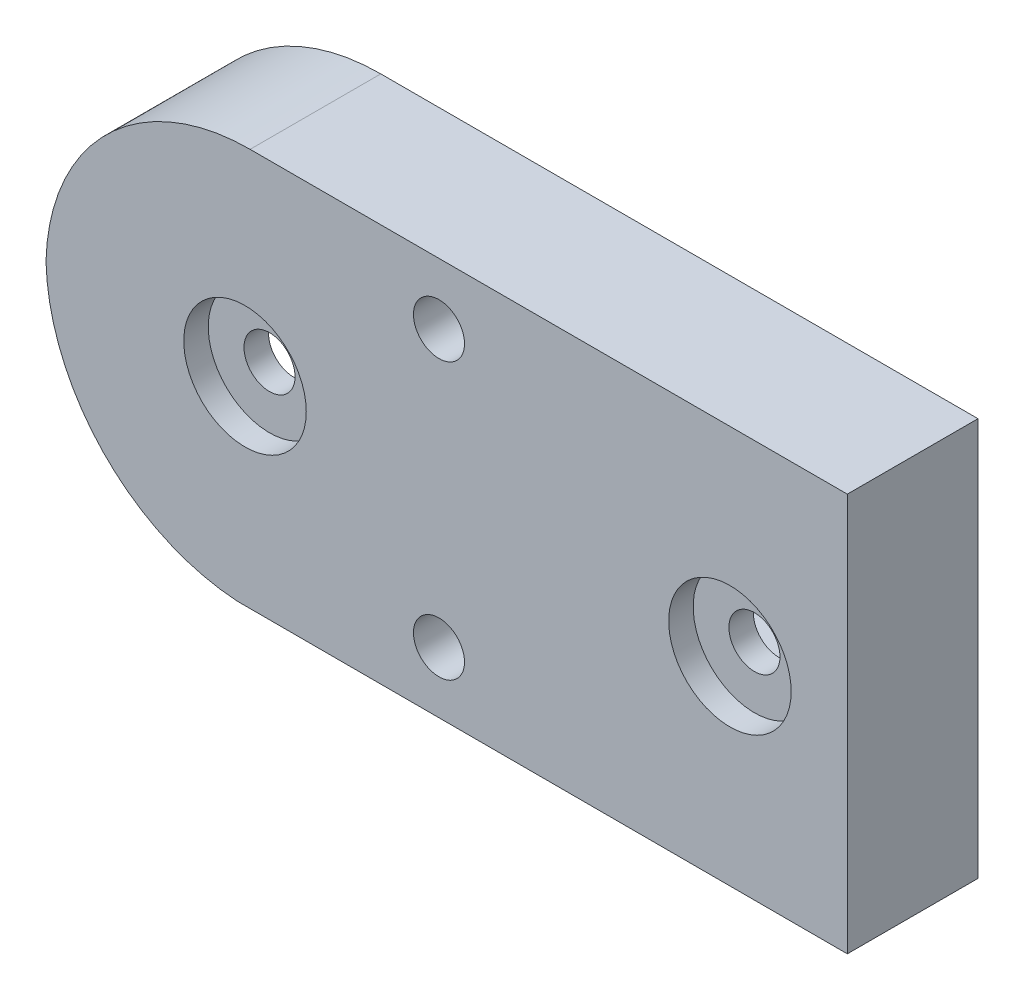
ISO-10303-21;
HEADER;
FILE_DESCRIPTION(('STEP AP214'),'2;1');
FILE_NAME('part.step','',(''),(''),'','','');
FILE_SCHEMA(('AUTOMOTIVE_DESIGN { 1 0 10303 214 1 1 1 1 }'));
ENDSEC;
DATA;
#1=APPLICATION_CONTEXT('core data for automotive mechanical design processes');
#2=APPLICATION_PROTOCOL_DEFINITION('international standard','automotive_design',2000,#1);
#3=PRODUCT_CONTEXT('',#1,'mechanical');
#4=PRODUCT('Part','Part','',(#3));
#5=PRODUCT_RELATED_PRODUCT_CATEGORY('part','',(#4));
#6=PRODUCT_DEFINITION_FORMATION('','',#4);
#7=PRODUCT_DEFINITION_CONTEXT('part definition',#1,'design');
#8=PRODUCT_DEFINITION('design','',#6,#7);
#9=PRODUCT_DEFINITION_SHAPE('','',#8);
#10=(LENGTH_UNIT() NAMED_UNIT(*) SI_UNIT(.MILLI.,.METRE.));
#11=(NAMED_UNIT(*) PLANE_ANGLE_UNIT() SI_UNIT($,.RADIAN.));
#12=(NAMED_UNIT(*) SI_UNIT($,.STERADIAN.) SOLID_ANGLE_UNIT());
#13=UNCERTAINTY_MEASURE_WITH_UNIT(LENGTH_MEASURE(1.E-05),#10,'distance_accuracy_value','');
#14=(GEOMETRIC_REPRESENTATION_CONTEXT(3) GLOBAL_UNCERTAINTY_ASSIGNED_CONTEXT((#13)) GLOBAL_UNIT_ASSIGNED_CONTEXT((#10,
#11,#12)) REPRESENTATION_CONTEXT('',''));
#15=CARTESIAN_POINT('',(0.,0.,0.));
#16=DIRECTION('',(0.,0.,1.));
#17=DIRECTION('',(1.,0.,0.));
#18=AXIS2_PLACEMENT_3D('',#15,#16,#17);
#19=CARTESIAN_POINT('',(0.,0.,5.2));
#20=DIRECTION('',(0.,0.,1.));
#21=DIRECTION('',(1.,0.,0.));
#22=AXIS2_PLACEMENT_3D('',#19,#20,#21);
#23=PLANE('',#22);
#24=CARTESIAN_POINT('',(0.,0.,5.2));
#25=DIRECTION('',(0.,0.,1.));
#26=DIRECTION('',(1.,0.,0.));
#27=AXIS2_PLACEMENT_3D('',#24,#25,#26);
#28=CIRCLE('',#27,1.25);
#29=CARTESIAN_POINT('',(1.25,0.,5.2));
#30=VERTEX_POINT('',#29);
#31=EDGE_CURVE('E189',#30,#30,#28,.T.);
#32=ORIENTED_EDGE('',*,*,#31,.F.);
#33=EDGE_LOOP('',(#32));
#34=FACE_BOUND('',#33,.T.);
#35=CARTESIAN_POINT('',(0.,0.,5.2));
#36=DIRECTION('',(0.,0.,1.));
#37=DIRECTION('',(1.,0.,0.));
#38=AXIS2_PLACEMENT_3D('',#35,#36,#37);
#39=CIRCLE('',#38,3.);
#40=CARTESIAN_POINT('',(3.,0.,5.2));
#41=VERTEX_POINT('',#40);
#42=EDGE_CURVE('E184',#41,#41,#39,.T.);
#43=ORIENTED_EDGE('',*,*,#42,.T.);
#44=EDGE_LOOP('',(#43));
#45=FACE_BOUND('',#44,.T.);
#46=ADVANCED_FACE('F47',(#34,#45),#23,.T.);
#47=CARTESIAN_POINT('',(23.75,0.,5.2));
#48=DIRECTION('',(0.,0.,1.));
#49=DIRECTION('',(1.,0.,0.));
#50=AXIS2_PLACEMENT_3D('',#47,#48,#49);
#51=CIRCLE('',#50,1.25);
#52=CARTESIAN_POINT('',(25.,0.,5.2));
#53=VERTEX_POINT('',#52);
#54=EDGE_CURVE('E146',#53,#53,#51,.T.);
#55=ORIENTED_EDGE('',*,*,#54,.F.);
#56=EDGE_LOOP('',(#55));
#57=FACE_BOUND('',#56,.T.);
#58=CARTESIAN_POINT('',(23.75,0.,5.2));
#59=DIRECTION('',(0.,0.,1.));
#60=DIRECTION('',(1.,0.,0.));
#61=AXIS2_PLACEMENT_3D('',#58,#59,#60);
#62=CIRCLE('',#61,3.);
#63=CARTESIAN_POINT('',(26.75,0.,5.2));
#64=VERTEX_POINT('',#63);
#65=EDGE_CURVE('E168',#64,#64,#62,.T.);
#66=ORIENTED_EDGE('',*,*,#65,.T.);
#67=EDGE_LOOP('',(#66));
#68=FACE_BOUND('',#67,.T.);
#69=ADVANCED_FACE('F331',(#57,#68),#23,.T.);
#70=CARTESIAN_POINT('',(0.,0.,4.));
#71=DIRECTION('',(0.,0.,1.));
#72=DIRECTION('',(1.,0.,0.));
#73=AXIS2_PLACEMENT_3D('',#70,#71,#72);
#74=PLANE('',#73);
#75=DIRECTION('',(1.,0.,0.));
#76=VECTOR('',#75,1.);
#77=CARTESIAN_POINT('',(0.,-9.75,4.));
#78=LINE('',#77,#76);
#79=CARTESIAN_POINT('',(0.25,-9.75,4.));
#80=VERTEX_POINT('',#79);
#81=CARTESIAN_POINT('',(29.5,-9.75,4.));
#82=VERTEX_POINT('',#81);
#83=EDGE_CURVE('E202',#80,#82,#78,.T.);
#84=ORIENTED_EDGE('',*,*,#83,.T.);
#85=DIRECTION('',(-0.999999767070476,0.000682538639031551,0.));
#86=VECTOR('',#85,1.);
#87=CARTESIAN_POINT('',(-0.00664100734015322,-9.72986057271339,4.));
#88=LINE('',#87,#86);
#89=CARTESIAN_POINT('',(-0.388423062468493,-9.72959999164838,4.));
#90=VERTEX_POINT('',#89);
#91=EDGE_CURVE('E142',#82,#90,#88,.T.);
#92=ORIENTED_EDGE('',*,*,#91,.T.);
#93=CARTESIAN_POINT('',(0.25,0.250000000000002,4.));
#94=DIRECTION('',(0.,0.,1.));
#95=DIRECTION('',(1.,0.,0.));
#96=AXIS2_PLACEMENT_3D('',#93,#94,#95);
#97=CIRCLE('',#96,10.);
#98=EDGE_CURVE('E56',#90,#80,#97,.T.);
#99=ORIENTED_EDGE('',*,*,#98,.T.);
#100=EDGE_LOOP('',(#84,#92,#99));
#101=FACE_BOUND('',#100,.T.);
#102=ADVANCED_FACE('F277',(#101),#74,.T.);
#103=CARTESIAN_POINT('',(11.2249721603218,-13.75,4.));
#104=DIRECTION('',(0.,0.,-1.));
#105=DIRECTION('',(-1.,0.,0.));
#106=AXIS2_PLACEMENT_3D('',#103,#104,#105);
#107=CYLINDRICAL_SURFACE('',#106,10.);
#108=CARTESIAN_POINT('',(11.2249721603218,-13.75,0.));
#109=DIRECTION('',(0.,0.,1.));
#110=DIRECTION('',(1.,0.,0.));
#111=AXIS2_PLACEMENT_3D('',#108,#109,#110);
#112=CIRCLE('',#111,10.);
#113=CARTESIAN_POINT('',(11.2249721603218,-3.75,0.));
#114=VERTEX_POINT('',#113);
#115=CARTESIAN_POINT('',(4.90104418267572,-6.00352112676056,0.));
#116=VERTEX_POINT('',#115);
#117=EDGE_CURVE('E236',#114,#116,#112,.T.);
#118=ORIENTED_EDGE('',*,*,#117,.T.);
#119=DIRECTION('',(0.,0.,-1.));
#120=VECTOR('',#119,1.);
#121=CARTESIAN_POINT('',(4.90104418267572,-6.00352112676056,4.));
#122=LINE('',#121,#120);
#123=CARTESIAN_POINT('',(4.90104418267572,-6.00352112676056,4.));
#124=VERTEX_POINT('',#123);
#125=EDGE_CURVE('E264',#124,#116,#122,.T.);
#126=ORIENTED_EDGE('',*,*,#125,.F.);
#127=CARTESIAN_POINT('',(11.2249721603218,-13.75,4.));
#128=DIRECTION('',(0.,0.,1.));
#129=DIRECTION('',(1.,0.,0.));
#130=AXIS2_PLACEMENT_3D('',#127,#128,#129);
#131=CIRCLE('',#130,10.);
#132=CARTESIAN_POINT('',(11.2249721603218,-3.75,4.));
#133=VERTEX_POINT('',#132);
#134=EDGE_CURVE('E204',#133,#124,#131,.T.);
#135=ORIENTED_EDGE('',*,*,#134,.F.);
#136=DIRECTION('',(0.,0.,-1.));
#137=VECTOR('',#136,1.);
#138=CARTESIAN_POINT('',(11.2249721603218,-3.75,4.));
#139=LINE('',#138,#137);
#140=EDGE_CURVE('E252',#133,#114,#139,.T.);
#141=ORIENTED_EDGE('',*,*,#140,.T.);
#142=EDGE_LOOP('',(#118,#126,#135,#141));
#143=FACE_BOUND('',#142,.T.);
#144=ADVANCED_FACE('F303',(#143),#107,.T.);
#145=CARTESIAN_POINT('',(0.,0.,4.));
#146=DIRECTION('',(0.,0.,-1.));
#147=DIRECTION('',(-1.,0.,0.));
#148=AXIS2_PLACEMENT_3D('',#145,#146,#147);
#149=CYLINDRICAL_SURFACE('',#148,7.75);
#150=CARTESIAN_POINT('',(0.,0.,0.));
#151=DIRECTION('',(0.,0.,1.));
#152=DIRECTION('',(1.,0.,0.));
#153=AXIS2_PLACEMENT_3D('',#150,#151,#152);
#154=CIRCLE('',#153,7.75);
#155=CARTESIAN_POINT('',(4.90104418267573,6.00352112676056,0.));
#156=VERTEX_POINT('',#155);
#157=EDGE_CURVE('E239',#156,#116,#154,.T.);
#158=ORIENTED_EDGE('',*,*,#157,.F.);
#159=DIRECTION('',(0.,0.,-1.));
#160=VECTOR('',#159,1.);
#161=CARTESIAN_POINT('',(4.90104418267573,6.00352112676056,4.));
#162=LINE('',#161,#160);
#163=CARTESIAN_POINT('',(4.90104418267573,6.00352112676056,4.));
#164=VERTEX_POINT('',#163);
#165=EDGE_CURVE('E262',#164,#156,#162,.T.);
#166=ORIENTED_EDGE('',*,*,#165,.F.);
#167=CARTESIAN_POINT('',(0.,0.,4.));
#168=DIRECTION('',(0.,0.,1.));
#169=DIRECTION('',(1.,0.,0.));
#170=AXIS2_PLACEMENT_3D('',#167,#168,#169);
#171=CIRCLE('',#170,7.75);
#172=EDGE_CURVE('E208',#164,#124,#171,.T.);
#173=ORIENTED_EDGE('',*,*,#172,.T.);
#174=ORIENTED_EDGE('',*,*,#125,.T.);
#175=EDGE_LOOP('',(#158,#166,#173,#174));
#176=FACE_BOUND('',#175,.T.);
#177=ADVANCED_FACE('F321',(#176),#149,.F.);
#178=CARTESIAN_POINT('',(11.2249721603218,13.75,4.));
#179=DIRECTION('',(0.,0.,-1.));
#180=DIRECTION('',(-1.,0.,0.));
#181=AXIS2_PLACEMENT_3D('',#178,#179,#180);
#182=CYLINDRICAL_SURFACE('',#181,10.);
#183=CARTESIAN_POINT('',(11.2249721603218,13.75,0.));
#184=DIRECTION('',(0.,0.,1.));
#185=DIRECTION('',(1.,0.,0.));
#186=AXIS2_PLACEMENT_3D('',#183,#184,#185);
#187=CIRCLE('',#186,10.);
#188=CARTESIAN_POINT('',(11.2249721603218,3.75,0.));
#189=VERTEX_POINT('',#188);
#190=EDGE_CURVE('E242',#156,#189,#187,.T.);
#191=ORIENTED_EDGE('',*,*,#190,.T.);
#192=DIRECTION('',(0.,0.,-1.));
#193=VECTOR('',#192,1.);
#194=CARTESIAN_POINT('',(11.2249721603218,3.75,4.));
#195=LINE('',#194,#193);
#196=CARTESIAN_POINT('',(11.2249721603218,3.75,4.));
#197=VERTEX_POINT('',#196);
#198=EDGE_CURVE('E260',#197,#189,#195,.T.);
#199=ORIENTED_EDGE('',*,*,#198,.F.);
#200=CARTESIAN_POINT('',(11.2249721603218,13.75,4.));
#201=DIRECTION('',(0.,0.,1.));
#202=DIRECTION('',(1.,0.,0.));
#203=AXIS2_PLACEMENT_3D('',#200,#201,#202);
#204=CIRCLE('',#203,10.);
#205=EDGE_CURVE('E211',#164,#197,#204,.T.);
#206=ORIENTED_EDGE('',*,*,#205,.F.);
#207=ORIENTED_EDGE('',*,*,#165,.T.);
#208=EDGE_LOOP('',(#191,#199,#206,#207));
#209=FACE_BOUND('',#208,.T.);
#210=ADVANCED_FACE('F319',(#209),#182,.T.);
#211=CARTESIAN_POINT('',(0.,3.75,4.));
#212=DIRECTION('',(0.,-1.,0.));
#213=DIRECTION('',(0.,0.,-1.));
#214=AXIS2_PLACEMENT_3D('',#211,#212,#213);
#215=PLANE('',#214);
#216=DIRECTION('',(-1.,0.,0.));
#217=VECTOR('',#216,1.);
#218=CARTESIAN_POINT('',(0.,3.75,0.));
#219=LINE('',#218,#217);
#220=CARTESIAN_POINT('',(23.75,3.75,0.));
#221=VERTEX_POINT('',#220);
#222=EDGE_CURVE('E245',#221,#189,#219,.T.);
#223=ORIENTED_EDGE('',*,*,#222,.F.);
#224=DIRECTION('',(0.,0.,-1.));
#225=VECTOR('',#224,1.);
#226=CARTESIAN_POINT('',(23.75,3.75,4.));
#227=LINE('',#226,#225);
#228=CARTESIAN_POINT('',(23.75,3.75,4.));
#229=VERTEX_POINT('',#228);
#230=EDGE_CURVE('E258',#229,#221,#227,.T.);
#231=ORIENTED_EDGE('',*,*,#230,.F.);
#232=DIRECTION('',(-1.,0.,0.));
#233=VECTOR('',#232,1.);
#234=CARTESIAN_POINT('',(0.,3.75,4.));
#235=LINE('',#234,#233);
#236=EDGE_CURVE('E214',#229,#197,#235,.T.);
#237=ORIENTED_EDGE('',*,*,#236,.T.);
#238=ORIENTED_EDGE('',*,*,#198,.T.);
#239=EDGE_LOOP('',(#223,#231,#237,#238));
#240=FACE_BOUND('',#239,.T.);
#241=ADVANCED_FACE('F316',(#240),#215,.T.);
#242=CARTESIAN_POINT('',(23.75,0.,4.));
#243=DIRECTION('',(0.,0.,-1.));
#244=DIRECTION('',(-1.,0.,0.));
#245=AXIS2_PLACEMENT_3D('',#242,#243,#244);
#246=CYLINDRICAL_SURFACE('',#245,3.75);
#247=CARTESIAN_POINT('',(23.75,0.,0.));
#248=DIRECTION('',(0.,0.,1.));
#249=DIRECTION('',(1.,0.,0.));
#250=AXIS2_PLACEMENT_3D('',#247,#248,#249);
#251=CIRCLE('',#250,3.75);
#252=CARTESIAN_POINT('',(23.75,-3.75,0.));
#253=VERTEX_POINT('',#252);
#254=EDGE_CURVE('E248',#253,#221,#251,.T.);
#255=ORIENTED_EDGE('',*,*,#254,.F.);
#256=DIRECTION('',(0.,0.,-1.));
#257=VECTOR('',#256,1.);
#258=CARTESIAN_POINT('',(23.75,-3.75,4.));
#259=LINE('',#258,#257);
#260=CARTESIAN_POINT('',(23.75,-3.75,4.));
#261=VERTEX_POINT('',#260);
#262=EDGE_CURVE('E255',#261,#253,#259,.T.);
#263=ORIENTED_EDGE('',*,*,#262,.F.);
#264=CARTESIAN_POINT('',(23.75,0.,4.));
#265=DIRECTION('',(0.,0.,1.));
#266=DIRECTION('',(1.,0.,0.));
#267=AXIS2_PLACEMENT_3D('',#264,#265,#266);
#268=CIRCLE('',#267,3.75);
#269=EDGE_CURVE('E217',#261,#229,#268,.T.);
#270=ORIENTED_EDGE('',*,*,#269,.T.);
#271=ORIENTED_EDGE('',*,*,#230,.T.);
#272=EDGE_LOOP('',(#255,#263,#270,#271));
#273=FACE_BOUND('',#272,.T.);
#274=ADVANCED_FACE('F313',(#273),#246,.F.);
#275=CARTESIAN_POINT('',(0.,-9.75,4.));
#276=DIRECTION('',(0.,1.,0.));
#277=DIRECTION('',(0.,0.,1.));
#278=AXIS2_PLACEMENT_3D('',#275,#276,#277);
#279=PLANE('',#278);
#280=ORIENTED_EDGE('',*,*,#83,.F.);
#281=DIRECTION('',(0.,0.,-1.));
#282=VECTOR('',#281,1.);
#283=CARTESIAN_POINT('',(0.25,-9.75,0.));
#284=LINE('',#283,#282);
#285=CARTESIAN_POINT('',(0.25,-9.75,0.));
#286=VERTEX_POINT('',#285);
#287=EDGE_CURVE('E266',#80,#286,#284,.T.);
#288=ORIENTED_EDGE('',*,*,#287,.T.);
#289=DIRECTION('',(1.,0.,0.));
#290=VECTOR('',#289,1.);
#291=CARTESIAN_POINT('',(0.,-9.75,0.));
#292=LINE('',#291,#290);
#293=CARTESIAN_POINT('',(29.5,-9.75,0.));
#294=VERTEX_POINT('',#293);
#295=EDGE_CURVE('E229',#286,#294,#292,.T.);
#296=ORIENTED_EDGE('',*,*,#295,.T.);
#297=DIRECTION('',(0.,0.,-1.));
#298=VECTOR('',#297,1.);
#299=CARTESIAN_POINT('',(29.5,-9.75,4.));
#300=LINE('',#299,#298);
#301=EDGE_CURVE('E256',#82,#294,#300,.T.);
#302=ORIENTED_EDGE('',*,*,#301,.F.);
#303=EDGE_LOOP('',(#280,#288,#296,#302));
#304=FACE_BOUND('',#303,.T.);
#305=ADVANCED_FACE('F282',(#304),#279,.F.);
#306=CARTESIAN_POINT('',(29.5,0.,4.));
#307=DIRECTION('',(1.,0.,0.));
#308=DIRECTION('',(0.,0.,-1.));
#309=AXIS2_PLACEMENT_3D('',#306,#307,#308);
#310=PLANE('',#309);
#311=DIRECTION('',(0.,-1.,0.));
#312=VECTOR('',#311,1.);
#313=CARTESIAN_POINT('',(29.5,0.,0.));
#314=LINE('',#313,#312);
#315=CARTESIAN_POINT('',(29.5,9.75,0.));
#316=VERTEX_POINT('',#315);
#317=EDGE_CURVE('E231',#316,#294,#314,.T.);
#318=ORIENTED_EDGE('',*,*,#317,.F.);
#319=DIRECTION('',(0.,0.,-1.));
#320=VECTOR('',#319,1.);
#321=CARTESIAN_POINT('',(29.5,9.75,4.));
#322=LINE('',#321,#320);
#323=CARTESIAN_POINT('',(29.5,9.75,6.4));
#324=VERTEX_POINT('',#323);
#325=EDGE_CURVE('E153',#324,#316,#322,.T.);
#326=ORIENTED_EDGE('',*,*,#325,.F.);
#327=DIRECTION('',(0.,1.,0.));
#328=VECTOR('',#327,1.);
#329=CARTESIAN_POINT('',(29.5,0.,6.4));
#330=LINE('',#329,#328);
#331=CARTESIAN_POINT('',(29.5,-9.75,6.4));
#332=VERTEX_POINT('',#331);
#333=EDGE_CURVE('E149',#332,#324,#330,.T.);
#334=ORIENTED_EDGE('',*,*,#333,.F.);
#335=DIRECTION('',(0.,0.,-1.));
#336=VECTOR('',#335,1.);
#337=CARTESIAN_POINT('',(29.5,-9.75,5.2));
#338=LINE('',#337,#336);
#339=EDGE_CURVE('E137',#332,#82,#338,.T.);
#340=ORIENTED_EDGE('',*,*,#339,.T.);
#341=ORIENTED_EDGE('',*,*,#301,.T.);
#342=EDGE_LOOP('',(#318,#326,#334,#340,#341));
#343=FACE_BOUND('',#342,.T.);
#344=ADVANCED_FACE('F151',(#343),#310,.T.);
#345=CARTESIAN_POINT('',(0.,9.75,4.));
#346=DIRECTION('',(0.,1.,0.));
#347=DIRECTION('',(0.,0.,1.));
#348=AXIS2_PLACEMENT_3D('',#345,#346,#347);
#349=PLANE('',#348);
#350=DIRECTION('',(1.,0.,0.));
#351=VECTOR('',#350,1.);
#352=CARTESIAN_POINT('',(0.,9.75,0.));
#353=LINE('',#352,#351);
#354=CARTESIAN_POINT('',(0.25,9.75,0.));
#355=VERTEX_POINT('',#354);
#356=EDGE_CURVE('E234',#355,#316,#353,.T.);
#357=ORIENTED_EDGE('',*,*,#356,.F.);
#358=DIRECTION('',(0.,0.,-1.));
#359=VECTOR('',#358,1.);
#360=CARTESIAN_POINT('',(0.25,9.75,4.));
#361=LINE('',#360,#359);
#362=CARTESIAN_POINT('',(0.250000000000001,9.75,6.4));
#363=VERTEX_POINT('',#362);
#364=EDGE_CURVE('E11',#355,#363,#361,.F.);
#365=ORIENTED_EDGE('',*,*,#364,.T.);
#366=DIRECTION('',(-1.,0.,0.));
#367=VECTOR('',#366,1.);
#368=CARTESIAN_POINT('',(0.,9.75,6.4));
#369=LINE('',#368,#367);
#370=EDGE_CURVE('E157',#324,#363,#369,.T.);
#371=ORIENTED_EDGE('',*,*,#370,.F.);
#372=ORIENTED_EDGE('',*,*,#325,.T.);
#373=EDGE_LOOP('',(#357,#365,#371,#372));
#374=FACE_BOUND('',#373,.T.);
#375=ADVANCED_FACE('F290',(#374),#349,.T.);
#376=CARTESIAN_POINT('',(9.5,6.75,4.));
#377=DIRECTION('',(0.,0.,-1.));
#378=DIRECTION('',(-1.,0.,0.));
#379=AXIS2_PLACEMENT_3D('',#376,#377,#378);
#380=CYLINDRICAL_SURFACE('',#379,1.25);
#381=CARTESIAN_POINT('',(9.5,6.75,0.));
#382=DIRECTION('',(0.,0.,1.));
#383=DIRECTION('',(1.,0.,0.));
#384=AXIS2_PLACEMENT_3D('',#381,#382,#383);
#385=CIRCLE('',#384,1.25);
#386=CARTESIAN_POINT('',(10.75,6.75,0.));
#387=VERTEX_POINT('',#386);
#388=EDGE_CURVE('E226',#387,#387,#385,.T.);
#389=ORIENTED_EDGE('',*,*,#388,.F.);
#390=EDGE_LOOP('',(#389));
#391=FACE_BOUND('',#390,.T.);
#392=CARTESIAN_POINT('',(9.5,6.75,6.4));
#393=DIRECTION('',(0.,0.,1.));
#394=DIRECTION('',(1.,0.,0.));
#395=AXIS2_PLACEMENT_3D('',#392,#393,#394);
#396=CIRCLE('',#395,1.25);
#397=CARTESIAN_POINT('',(10.75,6.75,6.4));
#398=VERTEX_POINT('',#397);
#399=EDGE_CURVE('E181',#398,#398,#396,.F.);
#400=ORIENTED_EDGE('',*,*,#399,.F.);
#401=EDGE_LOOP('',(#400));
#402=FACE_BOUND('',#401,.T.);
#403=ADVANCED_FACE('F448',(#391,#402),#380,.F.);
#404=CARTESIAN_POINT('',(9.5,-6.75,4.));
#405=DIRECTION('',(0.,0.,-1.));
#406=DIRECTION('',(-1.,0.,0.));
#407=AXIS2_PLACEMENT_3D('',#404,#405,#406);
#408=CYLINDRICAL_SURFACE('',#407,1.25);
#409=CARTESIAN_POINT('',(9.5,-6.75,0.));
#410=DIRECTION('',(0.,0.,1.));
#411=DIRECTION('',(1.,0.,0.));
#412=AXIS2_PLACEMENT_3D('',#409,#410,#411);
#413=CIRCLE('',#412,1.25);
#414=CARTESIAN_POINT('',(10.75,-6.75,0.));
#415=VERTEX_POINT('',#414);
#416=EDGE_CURVE('E223',#415,#415,#413,.T.);
#417=ORIENTED_EDGE('',*,*,#416,.F.);
#418=EDGE_LOOP('',(#417));
#419=FACE_BOUND('',#418,.T.);
#420=CARTESIAN_POINT('',(9.5,-6.75,6.4));
#421=DIRECTION('',(0.,0.,1.));
#422=DIRECTION('',(1.,0.,0.));
#423=AXIS2_PLACEMENT_3D('',#420,#421,#422);
#424=CIRCLE('',#423,1.25);
#425=CARTESIAN_POINT('',(10.75,-6.75,6.4));
#426=VERTEX_POINT('',#425);
#427=EDGE_CURVE('E178',#426,#426,#424,.F.);
#428=ORIENTED_EDGE('',*,*,#427,.F.);
#429=EDGE_LOOP('',(#428));
#430=FACE_BOUND('',#429,.T.);
#431=ADVANCED_FACE('F363',(#419,#430),#408,.F.);
#432=CARTESIAN_POINT('',(0.,-3.75,4.));
#433=DIRECTION('',(0.,-1.,0.));
#434=DIRECTION('',(0.,0.,-1.));
#435=AXIS2_PLACEMENT_3D('',#432,#433,#434);
#436=PLANE('',#435);
#437=DIRECTION('',(-1.,0.,0.));
#438=VECTOR('',#437,1.);
#439=CARTESIAN_POINT('',(0.,-3.75,0.));
#440=LINE('',#439,#438);
#441=EDGE_CURVE('E205',#253,#114,#440,.T.);
#442=ORIENTED_EDGE('',*,*,#441,.T.);
#443=ORIENTED_EDGE('',*,*,#140,.F.);
#444=DIRECTION('',(-1.,0.,0.));
#445=VECTOR('',#444,1.);
#446=CARTESIAN_POINT('',(0.,-3.75,4.));
#447=LINE('',#446,#445);
#448=EDGE_CURVE('E220',#261,#133,#447,.T.);
#449=ORIENTED_EDGE('',*,*,#448,.F.);
#450=ORIENTED_EDGE('',*,*,#262,.T.);
#451=EDGE_LOOP('',(#442,#443,#449,#450));
#452=FACE_BOUND('',#451,.T.);
#453=ADVANCED_FACE('F294',(#452),#436,.F.);
#454=CARTESIAN_POINT('',(0.,0.,0.));
#455=DIRECTION('',(0.,0.,1.));
#456=DIRECTION('',(1.,0.,0.));
#457=AXIS2_PLACEMENT_3D('',#454,#455,#456);
#458=PLANE('',#457);
#459=ORIENTED_EDGE('',*,*,#416,.T.);
#460=EDGE_LOOP('',(#459));
#461=FACE_BOUND('',#460,.T.);
#462=ORIENTED_EDGE('',*,*,#388,.T.);
#463=EDGE_LOOP('',(#462));
#464=FACE_BOUND('',#463,.T.);
#465=ORIENTED_EDGE('',*,*,#295,.F.);
#466=CARTESIAN_POINT('',(0.25,0.250000000000002,0.));
#467=DIRECTION('',(0.,0.,1.));
#468=DIRECTION('',(1.,0.,0.));
#469=AXIS2_PLACEMENT_3D('',#466,#467,#468);
#470=CIRCLE('',#469,10.);
#471=CARTESIAN_POINT('',(-9.7468745115661,0.,0.));
#472=VERTEX_POINT('',#471);
#473=EDGE_CURVE('E71',#286,#472,#470,.F.);
#474=ORIENTED_EDGE('',*,*,#473,.T.);
#475=CARTESIAN_POINT('',(0.25,-0.250000000000002,0.));
#476=DIRECTION('',(0.,0.,1.));
#477=DIRECTION('',(1.,0.,0.));
#478=AXIS2_PLACEMENT_3D('',#475,#476,#477);
#479=CIRCLE('',#478,10.);
#480=EDGE_CURVE('E271',#472,#355,#479,.F.);
#481=ORIENTED_EDGE('',*,*,#480,.T.);
#482=ORIENTED_EDGE('',*,*,#356,.T.);
#483=ORIENTED_EDGE('',*,*,#317,.T.);
#484=EDGE_LOOP('',(#465,#474,#481,#482,#483));
#485=FACE_BOUND('',#484,.T.);
#486=ORIENTED_EDGE('',*,*,#117,.F.);
#487=ORIENTED_EDGE('',*,*,#441,.F.);
#488=ORIENTED_EDGE('',*,*,#254,.T.);
#489=ORIENTED_EDGE('',*,*,#222,.T.);
#490=ORIENTED_EDGE('',*,*,#190,.F.);
#491=ORIENTED_EDGE('',*,*,#157,.T.);
#492=EDGE_LOOP('',(#486,#487,#488,#489,#490,#491));
#493=FACE_BOUND('',#492,.T.);
#494=ADVANCED_FACE('F291',(#461,#464,#485,#493),#458,.F.);
#495=CARTESIAN_POINT('',(0.25,-0.250000000000002,4.));
#496=DIRECTION('',(0.,0.,-1.));
#497=DIRECTION('',(-1.,0.,0.));
#498=AXIS2_PLACEMENT_3D('',#495,#496,#497);
#499=CYLINDRICAL_SURFACE('',#498,10.);
#500=DIRECTION('',(0.,0.,-1.));
#501=VECTOR('',#500,1.);
#502=CARTESIAN_POINT('',(-9.7468745115661,0.,2.));
#503=LINE('',#502,#501);
#504=CARTESIAN_POINT('',(-9.7468745115661,0.,6.4));
#505=VERTEX_POINT('',#504);
#506=EDGE_CURVE('E51',#505,#472,#503,.T.);
#507=ORIENTED_EDGE('',*,*,#506,.F.);
#508=CARTESIAN_POINT('',(0.25,-0.250000000000002,6.4));
#509=DIRECTION('',(0.,0.,1.));
#510=DIRECTION('',(1.,0.,0.));
#511=AXIS2_PLACEMENT_3D('',#508,#509,#510);
#512=CIRCLE('',#511,10.);
#513=EDGE_CURVE('E172',#363,#505,#512,.T.);
#514=ORIENTED_EDGE('',*,*,#513,.F.);
#515=ORIENTED_EDGE('',*,*,#364,.F.);
#516=ORIENTED_EDGE('',*,*,#480,.F.);
#517=EDGE_LOOP('',(#507,#514,#515,#516));
#518=FACE_BOUND('',#517,.T.);
#519=ADVANCED_FACE('F49',(#518),#499,.T.);
#520=CARTESIAN_POINT('',(0.25,0.250000000000002,4.));
#521=DIRECTION('',(0.,0.,1.));
#522=DIRECTION('',(1.,0.,0.));
#523=AXIS2_PLACEMENT_3D('',#520,#521,#522);
#524=CYLINDRICAL_SURFACE('',#523,10.);
#525=ORIENTED_EDGE('',*,*,#98,.F.);
#526=DIRECTION('',(0.,0.,-1.));
#527=VECTOR('',#526,1.);
#528=CARTESIAN_POINT('',(-0.388423062468493,-9.72959999164838,5.2));
#529=LINE('',#528,#527);
#530=CARTESIAN_POINT('',(-0.388423062468493,-9.72959999164838,6.4));
#531=VERTEX_POINT('',#530);
#532=EDGE_CURVE('E63',#531,#90,#529,.T.);
#533=ORIENTED_EDGE('',*,*,#532,.F.);
#534=CARTESIAN_POINT('',(0.25,0.250000000000002,6.4));
#535=DIRECTION('',(0.,0.,1.));
#536=DIRECTION('',(1.,0.,0.));
#537=AXIS2_PLACEMENT_3D('',#534,#535,#536);
#538=CIRCLE('',#537,10.);
#539=EDGE_CURVE('E164',#505,#531,#538,.T.);
#540=ORIENTED_EDGE('',*,*,#539,.F.);
#541=ORIENTED_EDGE('',*,*,#506,.T.);
#542=ORIENTED_EDGE('',*,*,#473,.F.);
#543=ORIENTED_EDGE('',*,*,#287,.F.);
#544=EDGE_LOOP('',(#525,#533,#540,#541,#542,#543));
#545=FACE_BOUND('',#544,.T.);
#546=ADVANCED_FACE('F283',(#545),#524,.T.);
#547=CARTESIAN_POINT('',(0.,0.,4.));
#548=DIRECTION('',(0.,0.,1.));
#549=DIRECTION('',(1.,0.,0.));
#550=AXIS2_PLACEMENT_3D('',#547,#548,#549);
#551=PLANE('',#550);
#552=CARTESIAN_POINT('',(23.75,0.,4.));
#553=DIRECTION('',(0.,0.,1.));
#554=DIRECTION('',(1.,0.,0.));
#555=AXIS2_PLACEMENT_3D('',#552,#553,#554);
#556=CIRCLE('',#555,1.25);
#557=CARTESIAN_POINT('',(25.,0.,4.));
#558=VERTEX_POINT('',#557);
#559=EDGE_CURVE('E192',#558,#558,#556,.T.);
#560=ORIENTED_EDGE('',*,*,#559,.T.);
#561=EDGE_LOOP('',(#560));
#562=FACE_BOUND('',#561,.T.);
#563=CARTESIAN_POINT('',(0.,0.,4.));
#564=DIRECTION('',(0.,0.,1.));
#565=DIRECTION('',(1.,0.,0.));
#566=AXIS2_PLACEMENT_3D('',#563,#564,#565);
#567=CIRCLE('',#566,1.25);
#568=CARTESIAN_POINT('',(1.25,0.,4.));
#569=VERTEX_POINT('',#568);
#570=EDGE_CURVE('E196',#569,#569,#567,.T.);
#571=ORIENTED_EDGE('',*,*,#570,.T.);
#572=EDGE_LOOP('',(#571));
#573=FACE_BOUND('',#572,.T.);
#574=ORIENTED_EDGE('',*,*,#448,.T.);
#575=ORIENTED_EDGE('',*,*,#134,.T.);
#576=ORIENTED_EDGE('',*,*,#172,.F.);
#577=ORIENTED_EDGE('',*,*,#205,.T.);
#578=ORIENTED_EDGE('',*,*,#236,.F.);
#579=ORIENTED_EDGE('',*,*,#269,.F.);
#580=EDGE_LOOP('',(#574,#575,#576,#577,#578,#579));
#581=FACE_BOUND('',#580,.T.);
#582=ADVANCED_FACE('F309',(#562,#573,#581),#551,.F.);
#583=CARTESIAN_POINT('',(-0.00664100734015322,-9.72986057271339,5.2));
#584=DIRECTION('',(-0.000682538639031551,-0.999999767070476,0.));
#585=DIRECTION('',(0.999999767070476,-0.000682538639031551,0.));
#586=AXIS2_PLACEMENT_3D('',#583,#584,#585);
#587=PLANE('',#586);
#588=ORIENTED_EDGE('',*,*,#91,.F.);
#589=ORIENTED_EDGE('',*,*,#339,.F.);
#590=DIRECTION('',(0.999999767070476,-0.000682538639031551,0.));
#591=VECTOR('',#590,1.);
#592=CARTESIAN_POINT('',(-0.00664100734015322,-9.72986057271339,6.4));
#593=LINE('',#592,#591);
#594=EDGE_CURVE('E141',#531,#332,#593,.T.);
#595=ORIENTED_EDGE('',*,*,#594,.F.);
#596=ORIENTED_EDGE('',*,*,#532,.T.);
#597=EDGE_LOOP('',(#588,#589,#595,#596));
#598=FACE_BOUND('',#597,.T.);
#599=ADVANCED_FACE('F139',(#598),#587,.T.);
#600=CARTESIAN_POINT('',(0.,0.,5.2));
#601=DIRECTION('',(0.,0.,-1.));
#602=DIRECTION('',(-1.,0.,0.));
#603=AXIS2_PLACEMENT_3D('',#600,#601,#602);
#604=CYLINDRICAL_SURFACE('',#603,1.25);
#605=ORIENTED_EDGE('',*,*,#31,.T.);
#606=EDGE_LOOP('',(#605));
#607=FACE_BOUND('',#606,.T.);
#608=ORIENTED_EDGE('',*,*,#570,.F.);
#609=EDGE_LOOP('',(#608));
#610=FACE_BOUND('',#609,.T.);
#611=ADVANCED_FACE('F352',(#607,#610),#604,.F.);
#612=CARTESIAN_POINT('',(23.75,0.,5.2));
#613=DIRECTION('',(0.,0.,-1.));
#614=DIRECTION('',(-1.,0.,0.));
#615=AXIS2_PLACEMENT_3D('',#612,#613,#614);
#616=CYLINDRICAL_SURFACE('',#615,1.25);
#617=ORIENTED_EDGE('',*,*,#54,.T.);
#618=EDGE_LOOP('',(#617));
#619=FACE_BOUND('',#618,.T.);
#620=ORIENTED_EDGE('',*,*,#559,.F.);
#621=EDGE_LOOP('',(#620));
#622=FACE_BOUND('',#621,.T.);
#623=ADVANCED_FACE('F348',(#619,#622),#616,.F.);
#624=CARTESIAN_POINT('',(23.75,0.,6.4));
#625=DIRECTION('',(0.,0.,-1.));
#626=DIRECTION('',(-1.,0.,0.));
#627=AXIS2_PLACEMENT_3D('',#624,#625,#626);
#628=CYLINDRICAL_SURFACE('',#627,3.);
#629=CARTESIAN_POINT('',(23.75,0.,6.4));
#630=DIRECTION('',(0.,0.,1.));
#631=DIRECTION('',(1.,0.,0.));
#632=AXIS2_PLACEMENT_3D('',#629,#630,#631);
#633=CIRCLE('',#632,3.);
#634=CARTESIAN_POINT('',(26.75,0.,6.4));
#635=VERTEX_POINT('',#634);
#636=EDGE_CURVE('E175',#635,#635,#633,.T.);
#637=ORIENTED_EDGE('',*,*,#636,.T.);
#638=EDGE_LOOP('',(#637));
#639=FACE_BOUND('',#638,.T.);
#640=ORIENTED_EDGE('',*,*,#65,.F.);
#641=EDGE_LOOP('',(#640));
#642=FACE_BOUND('',#641,.T.);
#643=ADVANCED_FACE('F351',(#639,#642),#628,.F.);
#644=CARTESIAN_POINT('',(0.,0.,6.4));
#645=DIRECTION('',(0.,0.,-1.));
#646=DIRECTION('',(-1.,0.,0.));
#647=AXIS2_PLACEMENT_3D('',#644,#645,#646);
#648=CYLINDRICAL_SURFACE('',#647,3.);
#649=CARTESIAN_POINT('',(0.,0.,6.4));
#650=DIRECTION('',(0.,0.,1.));
#651=DIRECTION('',(1.,0.,0.));
#652=AXIS2_PLACEMENT_3D('',#649,#650,#651);
#653=CIRCLE('',#652,3.);
#654=CARTESIAN_POINT('',(3.,0.,6.4));
#655=VERTEX_POINT('',#654);
#656=EDGE_CURVE('E165',#655,#655,#653,.T.);
#657=ORIENTED_EDGE('',*,*,#656,.T.);
#658=EDGE_LOOP('',(#657));
#659=FACE_BOUND('',#658,.T.);
#660=ORIENTED_EDGE('',*,*,#42,.F.);
#661=EDGE_LOOP('',(#660));
#662=FACE_BOUND('',#661,.T.);
#663=ADVANCED_FACE('F343',(#659,#662),#648,.F.);
#664=CARTESIAN_POINT('',(0.,0.,6.4));
#665=DIRECTION('',(0.,0.,1.));
#666=DIRECTION('',(1.,0.,0.));
#667=AXIS2_PLACEMENT_3D('',#664,#665,#666);
#668=PLANE('',#667);
#669=ORIENTED_EDGE('',*,*,#656,.F.);
#670=EDGE_LOOP('',(#669));
#671=FACE_BOUND('',#670,.T.);
#672=ORIENTED_EDGE('',*,*,#594,.T.);
#673=ORIENTED_EDGE('',*,*,#333,.T.);
#674=ORIENTED_EDGE('',*,*,#370,.T.);
#675=ORIENTED_EDGE('',*,*,#513,.T.);
#676=ORIENTED_EDGE('',*,*,#539,.T.);
#677=EDGE_LOOP('',(#672,#673,#674,#675,#676));
#678=FACE_BOUND('',#677,.T.);
#679=ORIENTED_EDGE('',*,*,#636,.F.);
#680=EDGE_LOOP('',(#679));
#681=FACE_BOUND('',#680,.T.);
#682=ORIENTED_EDGE('',*,*,#427,.T.);
#683=EDGE_LOOP('',(#682));
#684=FACE_BOUND('',#683,.T.);
#685=ORIENTED_EDGE('',*,*,#399,.T.);
#686=EDGE_LOOP('',(#685));
#687=FACE_BOUND('',#686,.T.);
#688=ADVANCED_FACE('F160',(#671,#678,#681,#684,#687),#668,.T.);
#689=CLOSED_SHELL('',(#46,#69,#102,#144,#177,#210,#241,#274,#305,#344,#375,#403,#431,#453,#494,
#519,#546,#582,#599,#611,#623,#643,#663,#688));
#690=MANIFOLD_SOLID_BREP('B2',#689);
#691=ADVANCED_BREP_SHAPE_REPRESENTATION('',(#18,#690),#14);
#692=SHAPE_DEFINITION_REPRESENTATION(#9,#691);
ENDSEC;
END-ISO-10303-21;
